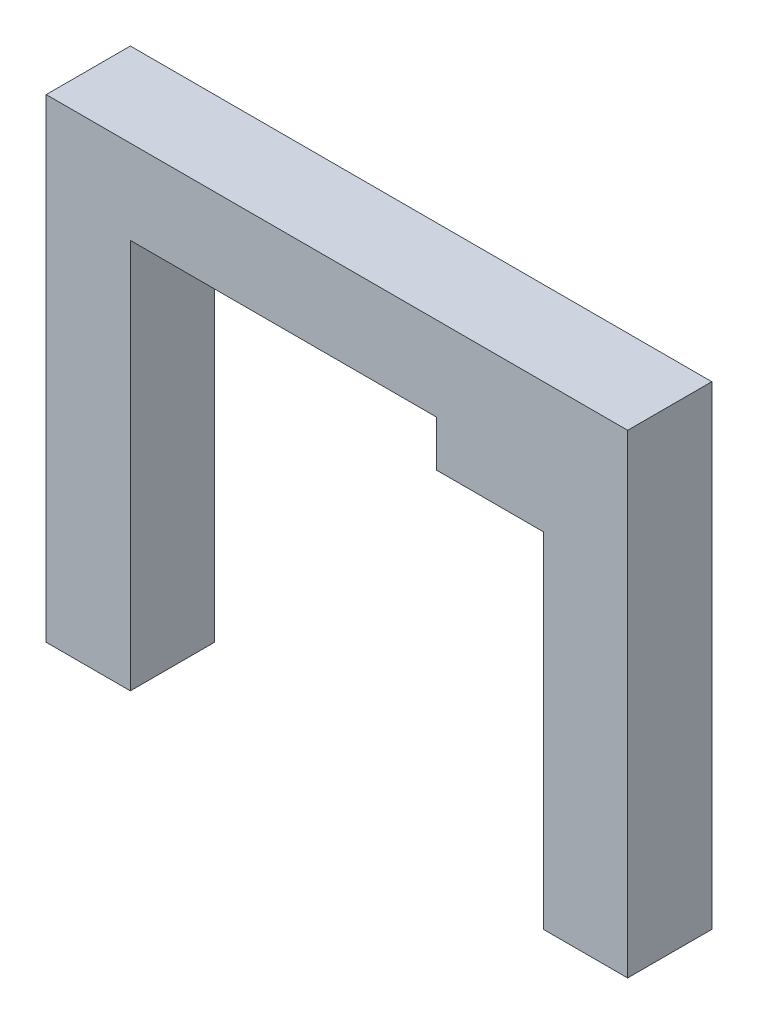
ISO-10303-21;
HEADER;
FILE_DESCRIPTION(('STEP AP214'),'2;1');
FILE_NAME('part.step','',(''),(''),'','','');
FILE_SCHEMA(('AUTOMOTIVE_DESIGN { 1 0 10303 214 1 1 1 1 }'));
ENDSEC;
DATA;
#1=APPLICATION_CONTEXT('core data for automotive mechanical design processes');
#2=APPLICATION_PROTOCOL_DEFINITION('international standard','automotive_design',2000,#1);
#3=PRODUCT_CONTEXT('',#1,'mechanical');
#4=PRODUCT('Part','Part','',(#3));
#5=PRODUCT_RELATED_PRODUCT_CATEGORY('part','',(#4));
#6=PRODUCT_DEFINITION_FORMATION('','',#4);
#7=PRODUCT_DEFINITION_CONTEXT('part definition',#1,'design');
#8=PRODUCT_DEFINITION('design','',#6,#7);
#9=PRODUCT_DEFINITION_SHAPE('','',#8);
#10=(LENGTH_UNIT() NAMED_UNIT(*) SI_UNIT(.MILLI.,.METRE.));
#11=(NAMED_UNIT(*) PLANE_ANGLE_UNIT() SI_UNIT($,.RADIAN.));
#12=(NAMED_UNIT(*) SI_UNIT($,.STERADIAN.) SOLID_ANGLE_UNIT());
#13=UNCERTAINTY_MEASURE_WITH_UNIT(LENGTH_MEASURE(1.E-05),#10,'distance_accuracy_value','');
#14=(GEOMETRIC_REPRESENTATION_CONTEXT(3) GLOBAL_UNCERTAINTY_ASSIGNED_CONTEXT((#13)) GLOBAL_UNIT_ASSIGNED_CONTEXT((#10,
#11,#12)) REPRESENTATION_CONTEXT('',''));
#15=CARTESIAN_POINT('',(0.,0.,0.));
#16=DIRECTION('',(0.,0.,1.));
#17=DIRECTION('',(1.,0.,0.));
#18=AXIS2_PLACEMENT_3D('',#15,#16,#17);
#19=CARTESIAN_POINT('',(0.,0.,5.5));
#20=DIRECTION('',(0.,1.,0.));
#21=DIRECTION('',(-1.,0.,0.));
#22=AXIS2_PLACEMENT_3D('',#19,#20,#21);
#23=PLANE('',#22);
#24=DIRECTION('',(1.,0.,0.));
#25=VECTOR('',#24,1.);
#26=CARTESIAN_POINT('',(0.,0.,0.));
#27=LINE('',#26,#25);
#28=CARTESIAN_POINT('',(-5.5,0.,0.));
#29=VERTEX_POINT('',#28);
#30=CARTESIAN_POINT('',(0.,0.,0.));
#31=VERTEX_POINT('',#30);
#32=EDGE_CURVE('E141',#29,#31,#27,.T.);
#33=ORIENTED_EDGE('',*,*,#32,.T.);
#34=DIRECTION('',(0.,0.,-1.));
#35=VECTOR('',#34,1.);
#36=CARTESIAN_POINT('',(0.,0.,5.5));
#37=LINE('',#36,#35);
#38=CARTESIAN_POINT('',(0.,0.,5.5));
#39=VERTEX_POINT('',#38);
#40=EDGE_CURVE('E11',#39,#31,#37,.T.);
#41=ORIENTED_EDGE('',*,*,#40,.F.);
#42=DIRECTION('',(1.,0.,0.));
#43=VECTOR('',#42,1.);
#44=CARTESIAN_POINT('',(0.,0.,5.5));
#45=LINE('',#44,#43);
#46=CARTESIAN_POINT('',(-5.5,0.,5.5));
#47=VERTEX_POINT('',#46);
#48=EDGE_CURVE('E159',#47,#39,#45,.T.);
#49=ORIENTED_EDGE('',*,*,#48,.F.);
#50=DIRECTION('',(0.,0.,-1.));
#51=VECTOR('',#50,1.);
#52=CARTESIAN_POINT('',(-5.5,0.,5.5));
#53=LINE('',#52,#51);
#54=EDGE_CURVE('E137',#47,#29,#53,.T.);
#55=ORIENTED_EDGE('',*,*,#54,.T.);
#56=EDGE_LOOP('',(#33,#41,#49,#55));
#57=FACE_BOUND('',#56,.T.);
#58=ADVANCED_FACE('F33',(#57),#23,.F.);
#59=CARTESIAN_POINT('',(0.,0.,5.5));
#60=DIRECTION('',(-1.,0.,0.));
#61=DIRECTION('',(0.,0.,1.));
#62=AXIS2_PLACEMENT_3D('',#59,#60,#61);
#63=PLANE('',#62);
#64=DIRECTION('',(0.,1.,0.));
#65=VECTOR('',#64,1.);
#66=CARTESIAN_POINT('',(0.,0.,0.));
#67=LINE('',#66,#65);
#68=CARTESIAN_POINT('',(0.,25.5,0.));
#69=VERTEX_POINT('',#68);
#70=EDGE_CURVE('E144',#31,#69,#67,.T.);
#71=ORIENTED_EDGE('',*,*,#70,.T.);
#72=DIRECTION('',(0.,0.,-1.));
#73=VECTOR('',#72,1.);
#74=CARTESIAN_POINT('',(0.,25.5,5.5));
#75=LINE('',#74,#73);
#76=CARTESIAN_POINT('',(0.,25.5,5.5));
#77=VERTEX_POINT('',#76);
#78=EDGE_CURVE('E41',#77,#69,#75,.T.);
#79=ORIENTED_EDGE('',*,*,#78,.F.);
#80=DIRECTION('',(0.,1.,0.));
#81=VECTOR('',#80,1.);
#82=CARTESIAN_POINT('',(0.,0.,5.5));
#83=LINE('',#82,#81);
#84=EDGE_CURVE('E98',#39,#77,#83,.T.);
#85=ORIENTED_EDGE('',*,*,#84,.F.);
#86=ORIENTED_EDGE('',*,*,#40,.T.);
#87=EDGE_LOOP('',(#71,#79,#85,#86));
#88=FACE_BOUND('',#87,.T.);
#89=ADVANCED_FACE('F208',(#88),#63,.F.);
#90=CARTESIAN_POINT('',(20.,25.5,5.5));
#91=DIRECTION('',(0.,1.,0.));
#92=DIRECTION('',(-1.,0.,0.));
#93=AXIS2_PLACEMENT_3D('',#90,#91,#92);
#94=PLANE('',#93);
#95=DIRECTION('',(1.,0.,0.));
#96=VECTOR('',#95,1.);
#97=CARTESIAN_POINT('',(20.,25.5,0.));
#98=LINE('',#97,#96);
#99=CARTESIAN_POINT('',(20.,25.5,0.));
#100=VERTEX_POINT('',#99);
#101=EDGE_CURVE('E146',#69,#100,#98,.T.);
#102=ORIENTED_EDGE('',*,*,#101,.T.);
#103=DIRECTION('',(0.,0.,-1.));
#104=VECTOR('',#103,1.);
#105=CARTESIAN_POINT('',(20.,25.5,5.5));
#106=LINE('',#105,#104);
#107=CARTESIAN_POINT('',(20.,25.5,5.5));
#108=VERTEX_POINT('',#107);
#109=EDGE_CURVE('E172',#108,#100,#106,.T.);
#110=ORIENTED_EDGE('',*,*,#109,.F.);
#111=DIRECTION('',(1.,0.,0.));
#112=VECTOR('',#111,1.);
#113=CARTESIAN_POINT('',(20.,25.5,5.5));
#114=LINE('',#113,#112);
#115=EDGE_CURVE('E180',#77,#108,#114,.T.);
#116=ORIENTED_EDGE('',*,*,#115,.F.);
#117=ORIENTED_EDGE('',*,*,#78,.T.);
#118=EDGE_LOOP('',(#102,#110,#116,#117));
#119=FACE_BOUND('',#118,.T.);
#120=ADVANCED_FACE('F178',(#119),#94,.F.);
#121=CARTESIAN_POINT('',(20.,22.5,5.5));
#122=DIRECTION('',(1.,0.,0.));
#123=DIRECTION('',(0.,1.,0.));
#124=AXIS2_PLACEMENT_3D('',#121,#122,#123);
#125=PLANE('',#124);
#126=DIRECTION('',(0.,-1.,0.));
#127=VECTOR('',#126,1.);
#128=CARTESIAN_POINT('',(20.,22.5,0.));
#129=LINE('',#128,#127);
#130=CARTESIAN_POINT('',(20.,22.5,0.));
#131=VERTEX_POINT('',#130);
#132=EDGE_CURVE('E148',#100,#131,#129,.T.);
#133=ORIENTED_EDGE('',*,*,#132,.T.);
#134=DIRECTION('',(0.,0.,-1.));
#135=VECTOR('',#134,1.);
#136=CARTESIAN_POINT('',(20.,22.5,5.5));
#137=LINE('',#136,#135);
#138=CARTESIAN_POINT('',(20.,22.5,5.5));
#139=VERTEX_POINT('',#138);
#140=EDGE_CURVE('E169',#139,#131,#137,.T.);
#141=ORIENTED_EDGE('',*,*,#140,.F.);
#142=DIRECTION('',(0.,-1.,0.));
#143=VECTOR('',#142,1.);
#144=CARTESIAN_POINT('',(20.,22.5,5.5));
#145=LINE('',#144,#143);
#146=EDGE_CURVE('E198',#108,#139,#145,.T.);
#147=ORIENTED_EDGE('',*,*,#146,.F.);
#148=ORIENTED_EDGE('',*,*,#109,.T.);
#149=EDGE_LOOP('',(#133,#141,#147,#148));
#150=FACE_BOUND('',#149,.T.);
#151=ADVANCED_FACE('F189',(#150),#125,.F.);
#152=CARTESIAN_POINT('',(27.,22.5,5.5));
#153=DIRECTION('',(0.,1.,0.));
#154=DIRECTION('',(0.,0.,1.));
#155=AXIS2_PLACEMENT_3D('',#152,#153,#154);
#156=PLANE('',#155);
#157=DIRECTION('',(1.,0.,0.));
#158=VECTOR('',#157,1.);
#159=CARTESIAN_POINT('',(27.,22.5,0.));
#160=LINE('',#159,#158);
#161=CARTESIAN_POINT('',(27.,22.5,0.));
#162=VERTEX_POINT('',#161);
#163=EDGE_CURVE('E150',#131,#162,#160,.T.);
#164=ORIENTED_EDGE('',*,*,#163,.T.);
#165=DIRECTION('',(0.,0.,-1.));
#166=VECTOR('',#165,1.);
#167=CARTESIAN_POINT('',(27.,22.5,5.5));
#168=LINE('',#167,#166);
#169=CARTESIAN_POINT('',(27.,22.5,5.5));
#170=VERTEX_POINT('',#169);
#171=EDGE_CURVE('E166',#170,#162,#168,.T.);
#172=ORIENTED_EDGE('',*,*,#171,.F.);
#173=DIRECTION('',(1.,0.,0.));
#174=VECTOR('',#173,1.);
#175=CARTESIAN_POINT('',(27.,22.5,5.5));
#176=LINE('',#175,#174);
#177=EDGE_CURVE('E195',#139,#170,#176,.T.);
#178=ORIENTED_EDGE('',*,*,#177,.F.);
#179=ORIENTED_EDGE('',*,*,#140,.T.);
#180=EDGE_LOOP('',(#164,#172,#178,#179));
#181=FACE_BOUND('',#180,.T.);
#182=ADVANCED_FACE('F193',(#181),#156,.F.);
#183=CARTESIAN_POINT('',(27.,22.5,5.5));
#184=DIRECTION('',(1.,0.,0.));
#185=DIRECTION('',(0.,1.,0.));
#186=AXIS2_PLACEMENT_3D('',#183,#184,#185);
#187=PLANE('',#186);
#188=DIRECTION('',(0.,-1.,0.));
#189=VECTOR('',#188,1.);
#190=CARTESIAN_POINT('',(27.,22.5,0.));
#191=LINE('',#190,#189);
#192=CARTESIAN_POINT('',(27.,0.,0.));
#193=VERTEX_POINT('',#192);
#194=EDGE_CURVE('E152',#162,#193,#191,.T.);
#195=ORIENTED_EDGE('',*,*,#194,.T.);
#196=DIRECTION('',(0.,0.,-1.));
#197=VECTOR('',#196,1.);
#198=CARTESIAN_POINT('',(27.,0.,5.5));
#199=LINE('',#198,#197);
#200=CARTESIAN_POINT('',(27.,0.,5.5));
#201=VERTEX_POINT('',#200);
#202=EDGE_CURVE('E163',#201,#193,#199,.T.);
#203=ORIENTED_EDGE('',*,*,#202,.F.);
#204=DIRECTION('',(0.,-1.,0.));
#205=VECTOR('',#204,1.);
#206=CARTESIAN_POINT('',(27.,22.5,5.5));
#207=LINE('',#206,#205);
#208=EDGE_CURVE('E197',#170,#201,#207,.T.);
#209=ORIENTED_EDGE('',*,*,#208,.F.);
#210=ORIENTED_EDGE('',*,*,#171,.T.);
#211=EDGE_LOOP('',(#195,#203,#209,#210));
#212=FACE_BOUND('',#211,.T.);
#213=ADVANCED_FACE('F220',(#212),#187,.F.);
#214=CARTESIAN_POINT('',(32.5,0.,5.5));
#215=DIRECTION('',(0.,1.,0.));
#216=DIRECTION('',(-1.,0.,0.));
#217=AXIS2_PLACEMENT_3D('',#214,#215,#216);
#218=PLANE('',#217);
#219=DIRECTION('',(1.,0.,0.));
#220=VECTOR('',#219,1.);
#221=CARTESIAN_POINT('',(32.5,0.,0.));
#222=LINE('',#221,#220);
#223=CARTESIAN_POINT('',(32.5,0.,0.));
#224=VERTEX_POINT('',#223);
#225=EDGE_CURVE('E154',#193,#224,#222,.T.);
#226=ORIENTED_EDGE('',*,*,#225,.T.);
#227=DIRECTION('',(0.,0.,-1.));
#228=VECTOR('',#227,1.);
#229=CARTESIAN_POINT('',(32.5,0.,5.5));
#230=LINE('',#229,#228);
#231=CARTESIAN_POINT('',(32.5,0.,5.5));
#232=VERTEX_POINT('',#231);
#233=EDGE_CURVE('E132',#232,#224,#230,.T.);
#234=ORIENTED_EDGE('',*,*,#233,.F.);
#235=DIRECTION('',(1.,0.,0.));
#236=VECTOR('',#235,1.);
#237=CARTESIAN_POINT('',(32.5,0.,5.5));
#238=LINE('',#237,#236);
#239=EDGE_CURVE('E123',#201,#232,#238,.T.);
#240=ORIENTED_EDGE('',*,*,#239,.F.);
#241=ORIENTED_EDGE('',*,*,#202,.T.);
#242=EDGE_LOOP('',(#226,#234,#240,#241));
#243=FACE_BOUND('',#242,.T.);
#244=ADVANCED_FACE('F223',(#243),#218,.F.);
#245=CARTESIAN_POINT('',(32.5,31.,5.5));
#246=DIRECTION('',(-1.,0.,0.));
#247=DIRECTION('',(0.,0.,1.));
#248=AXIS2_PLACEMENT_3D('',#245,#246,#247);
#249=PLANE('',#248);
#250=DIRECTION('',(0.,1.,0.));
#251=VECTOR('',#250,1.);
#252=CARTESIAN_POINT('',(32.5,31.,0.));
#253=LINE('',#252,#251);
#254=CARTESIAN_POINT('',(32.5,31.,0.));
#255=VERTEX_POINT('',#254);
#256=EDGE_CURVE('E131',#224,#255,#253,.T.);
#257=ORIENTED_EDGE('',*,*,#256,.T.);
#258=DIRECTION('',(0.,0.,-1.));
#259=VECTOR('',#258,1.);
#260=CARTESIAN_POINT('',(32.5,31.,5.5));
#261=LINE('',#260,#259);
#262=CARTESIAN_POINT('',(32.5,31.,5.5));
#263=VERTEX_POINT('',#262);
#264=EDGE_CURVE('E128',#263,#255,#261,.T.);
#265=ORIENTED_EDGE('',*,*,#264,.F.);
#266=DIRECTION('',(0.,1.,0.));
#267=VECTOR('',#266,1.);
#268=CARTESIAN_POINT('',(32.5,31.,5.5));
#269=LINE('',#268,#267);
#270=EDGE_CURVE('E117',#232,#263,#269,.T.);
#271=ORIENTED_EDGE('',*,*,#270,.F.);
#272=ORIENTED_EDGE('',*,*,#233,.T.);
#273=EDGE_LOOP('',(#257,#265,#271,#272));
#274=FACE_BOUND('',#273,.T.);
#275=ADVANCED_FACE('F129',(#274),#249,.F.);
#276=CARTESIAN_POINT('',(-5.5,31.,5.5));
#277=DIRECTION('',(0.,-1.,0.));
#278=DIRECTION('',(1.,0.,0.));
#279=AXIS2_PLACEMENT_3D('',#276,#277,#278);
#280=PLANE('',#279);
#281=DIRECTION('',(-1.,0.,0.));
#282=VECTOR('',#281,1.);
#283=CARTESIAN_POINT('',(-5.5,31.,0.));
#284=LINE('',#283,#282);
#285=CARTESIAN_POINT('',(-5.5,31.,0.));
#286=VERTEX_POINT('',#285);
#287=EDGE_CURVE('E84',#255,#286,#284,.T.);
#288=ORIENTED_EDGE('',*,*,#287,.T.);
#289=DIRECTION('',(0.,0.,-1.));
#290=VECTOR('',#289,1.);
#291=CARTESIAN_POINT('',(-5.5,31.,5.5));
#292=LINE('',#291,#290);
#293=CARTESIAN_POINT('',(-5.5,31.,5.5));
#294=VERTEX_POINT('',#293);
#295=EDGE_CURVE('E133',#294,#286,#292,.T.);
#296=ORIENTED_EDGE('',*,*,#295,.F.);
#297=DIRECTION('',(-1.,0.,0.));
#298=VECTOR('',#297,1.);
#299=CARTESIAN_POINT('',(-5.5,31.,5.5));
#300=LINE('',#299,#298);
#301=EDGE_CURVE('E121',#263,#294,#300,.T.);
#302=ORIENTED_EDGE('',*,*,#301,.F.);
#303=ORIENTED_EDGE('',*,*,#264,.T.);
#304=EDGE_LOOP('',(#288,#296,#302,#303));
#305=FACE_BOUND('',#304,.T.);
#306=ADVANCED_FACE('F135',(#305),#280,.F.);
#307=CARTESIAN_POINT('',(-5.5,0.,5.5));
#308=DIRECTION('',(1.,0.,0.));
#309=DIRECTION('',(0.,0.,-1.));
#310=AXIS2_PLACEMENT_3D('',#307,#308,#309);
#311=PLANE('',#310);
#312=DIRECTION('',(0.,-1.,0.));
#313=VECTOR('',#312,1.);
#314=CARTESIAN_POINT('',(-5.5,0.,0.));
#315=LINE('',#314,#313);
#316=EDGE_CURVE('E90',#286,#29,#315,.T.);
#317=ORIENTED_EDGE('',*,*,#316,.T.);
#318=ORIENTED_EDGE('',*,*,#54,.F.);
#319=DIRECTION('',(0.,-1.,0.));
#320=VECTOR('',#319,1.);
#321=CARTESIAN_POINT('',(-5.5,0.,5.5));
#322=LINE('',#321,#320);
#323=EDGE_CURVE('E49',#294,#47,#322,.T.);
#324=ORIENTED_EDGE('',*,*,#323,.F.);
#325=ORIENTED_EDGE('',*,*,#295,.T.);
#326=EDGE_LOOP('',(#317,#318,#324,#325));
#327=FACE_BOUND('',#326,.T.);
#328=ADVANCED_FACE('F232',(#327),#311,.F.);
#329=CARTESIAN_POINT('',(0.,0.,5.5));
#330=DIRECTION('',(0.,0.,-1.));
#331=DIRECTION('',(-1.,0.,0.));
#332=AXIS2_PLACEMENT_3D('',#329,#330,#331);
#333=PLANE('',#332);
#334=ORIENTED_EDGE('',*,*,#48,.T.);
#335=ORIENTED_EDGE('',*,*,#84,.T.);
#336=ORIENTED_EDGE('',*,*,#115,.T.);
#337=ORIENTED_EDGE('',*,*,#146,.T.);
#338=ORIENTED_EDGE('',*,*,#177,.T.);
#339=ORIENTED_EDGE('',*,*,#208,.T.);
#340=ORIENTED_EDGE('',*,*,#239,.T.);
#341=ORIENTED_EDGE('',*,*,#270,.T.);
#342=ORIENTED_EDGE('',*,*,#301,.T.);
#343=ORIENTED_EDGE('',*,*,#323,.T.);
#344=EDGE_LOOP('',(#334,#335,#336,#337,#338,#339,#340,#341,#342,#343));
#345=FACE_BOUND('',#344,.T.);
#346=ADVANCED_FACE('F119',(#345),#333,.F.);
#347=CARTESIAN_POINT('',(0.,0.,0.));
#348=DIRECTION('',(0.,0.,-1.));
#349=DIRECTION('',(-1.,0.,0.));
#350=AXIS2_PLACEMENT_3D('',#347,#348,#349);
#351=PLANE('',#350);
#352=ORIENTED_EDGE('',*,*,#32,.F.);
#353=ORIENTED_EDGE('',*,*,#316,.F.);
#354=ORIENTED_EDGE('',*,*,#287,.F.);
#355=ORIENTED_EDGE('',*,*,#256,.F.);
#356=ORIENTED_EDGE('',*,*,#225,.F.);
#357=ORIENTED_EDGE('',*,*,#194,.F.);
#358=ORIENTED_EDGE('',*,*,#163,.F.);
#359=ORIENTED_EDGE('',*,*,#132,.F.);
#360=ORIENTED_EDGE('',*,*,#101,.F.);
#361=ORIENTED_EDGE('',*,*,#70,.F.);
#362=EDGE_LOOP('',(#352,#353,#354,#355,#356,#357,#358,#359,#360,#361));
#363=FACE_BOUND('',#362,.T.);
#364=ADVANCED_FACE('F184',(#363),#351,.T.);
#365=CLOSED_SHELL('',(#58,#89,#120,#151,#182,#213,#244,#275,#306,#328,#346,#364));
#366=MANIFOLD_SOLID_BREP('B2',#365);
#367=ADVANCED_BREP_SHAPE_REPRESENTATION('',(#18,#366),#14);
#368=SHAPE_DEFINITION_REPRESENTATION(#9,#367);
ENDSEC;
END-ISO-10303-21;
